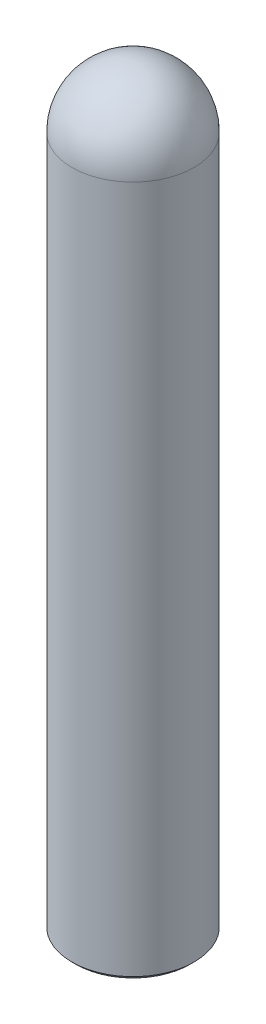
ISO-10303-21;
HEADER;
FILE_DESCRIPTION(('STEP AP214'),'2;1');
FILE_NAME('part.step','',(''),(''),'','','');
FILE_SCHEMA(('AUTOMOTIVE_DESIGN { 1 0 10303 214 1 1 1 1 }'));
ENDSEC;
DATA;
#1=APPLICATION_CONTEXT('core data for automotive mechanical design processes');
#2=APPLICATION_PROTOCOL_DEFINITION('international standard','automotive_design',2000,#1);
#3=PRODUCT_CONTEXT('',#1,'mechanical');
#4=PRODUCT('Part','Part','',(#3));
#5=PRODUCT_RELATED_PRODUCT_CATEGORY('part','',(#4));
#6=PRODUCT_DEFINITION_FORMATION('','',#4);
#7=PRODUCT_DEFINITION_CONTEXT('part definition',#1,'design');
#8=PRODUCT_DEFINITION('design','',#6,#7);
#9=PRODUCT_DEFINITION_SHAPE('','',#8);
#10=(LENGTH_UNIT() NAMED_UNIT(*) SI_UNIT(.MILLI.,.METRE.));
#11=(NAMED_UNIT(*) PLANE_ANGLE_UNIT() SI_UNIT($,.RADIAN.));
#12=(NAMED_UNIT(*) SI_UNIT($,.STERADIAN.) SOLID_ANGLE_UNIT());
#13=UNCERTAINTY_MEASURE_WITH_UNIT(LENGTH_MEASURE(1.E-05),#10,'distance_accuracy_value','');
#14=(GEOMETRIC_REPRESENTATION_CONTEXT(3) GLOBAL_UNCERTAINTY_ASSIGNED_CONTEXT((#13)) GLOBAL_UNIT_ASSIGNED_CONTEXT((#10,
#11,#12)) REPRESENTATION_CONTEXT('',''));
#15=CARTESIAN_POINT('',(0.,0.,0.));
#16=DIRECTION('',(0.,0.,1.));
#17=DIRECTION('',(1.,0.,0.));
#18=AXIS2_PLACEMENT_3D('',#15,#16,#17);
#19=CARTESIAN_POINT('',(0.,185.,0.));
#20=DIRECTION('',(0.,-1.,0.));
#21=DIRECTION('',(0.,0.,-1.));
#22=AXIS2_PLACEMENT_3D('',#19,#20,#21);
#23=CYLINDRICAL_SURFACE('',#22,15.);
#24=CARTESIAN_POINT('',(0.,1.00000000000003,0.));
#25=DIRECTION('',(0.,1.,0.));
#26=DIRECTION('',(0.,0.,1.));
#27=AXIS2_PLACEMENT_3D('',#24,#25,#26);
#28=CIRCLE('',#27,15.);
#29=CARTESIAN_POINT('',(0.,1.00000000000003,15.));
#30=VERTEX_POINT('',#29);
#31=EDGE_CURVE('E41',#30,#30,#28,.T.);
#32=ORIENTED_EDGE('',*,*,#31,.T.);
#33=EDGE_LOOP('',(#32));
#34=FACE_BOUND('',#33,.T.);
#35=CARTESIAN_POINT('',(0.,170.,0.));
#36=DIRECTION('',(0.,-1.,0.));
#37=DIRECTION('',(0.,0.,-1.));
#38=AXIS2_PLACEMENT_3D('',#35,#36,#37);
#39=CIRCLE('',#38,15.);
#40=CARTESIAN_POINT('',(0.,170.,-15.));
#41=VERTEX_POINT('',#40);
#42=EDGE_CURVE('E54',#41,#41,#39,.T.);
#43=ORIENTED_EDGE('',*,*,#42,.T.);
#44=EDGE_LOOP('',(#43));
#45=FACE_BOUND('',#44,.T.);
#46=ADVANCED_FACE('F33',(#34,#45),#23,.T.);
#47=CARTESIAN_POINT('',(0.,0.,0.));
#48=DIRECTION('',(0.,1.,0.));
#49=DIRECTION('',(0.,0.,1.));
#50=AXIS2_PLACEMENT_3D('',#47,#48,#49);
#51=PLANE('',#50);
#52=CARTESIAN_POINT('',(0.,0.,0.));
#53=DIRECTION('',(0.,1.,0.));
#54=DIRECTION('',(0.,0.,1.));
#55=AXIS2_PLACEMENT_3D('',#52,#53,#54);
#56=CIRCLE('',#55,14.);
#57=CARTESIAN_POINT('',(0.,0.,14.));
#58=VERTEX_POINT('',#57);
#59=EDGE_CURVE('E10',#58,#58,#56,.F.);
#60=ORIENTED_EDGE('',*,*,#59,.T.);
#61=EDGE_LOOP('',(#60));
#62=FACE_BOUND('',#61,.T.);
#63=CARTESIAN_POINT('',(0.,0.,0.));
#64=DIRECTION('',(0.,1.,0.));
#65=DIRECTION('',(0.,0.,1.));
#66=AXIS2_PLACEMENT_3D('',#63,#64,#65);
#67=CIRCLE('',#66,3.575);
#68=CARTESIAN_POINT('',(0.,0.,3.575));
#69=VERTEX_POINT('',#68);
#70=EDGE_CURVE('E45',#69,#69,#67,.T.);
#71=ORIENTED_EDGE('',*,*,#70,.T.);
#72=EDGE_LOOP('',(#71));
#73=FACE_BOUND('',#72,.T.);
#74=ADVANCED_FACE('F74',(#62,#73),#51,.F.);
#75=CARTESIAN_POINT('',(0.,170.,0.));
#76=DIRECTION('',(0.,1.,0.));
#77=DIRECTION('',(0.,0.,1.));
#78=AXIS2_PLACEMENT_3D('',#75,#76,#77);
#79=SPHERICAL_SURFACE('',#78,15.);
#80=ORIENTED_EDGE('',*,*,#42,.F.);
#81=EDGE_LOOP('',(#80));
#82=FACE_BOUND('',#81,.T.);
#83=ADVANCED_FACE('F65',(#82),#79,.T.);
#84=CARTESIAN_POINT('',(0.,12.,0.));
#85=DIRECTION('',(0.,-1.,0.));
#86=DIRECTION('',(0.,0.,-1.));
#87=AXIS2_PLACEMENT_3D('',#84,#85,#86);
#88=CYLINDRICAL_SURFACE('',#87,3.175);
#89=CARTESIAN_POINT('',(0.,0.400000000000006,0.));
#90=DIRECTION('',(0.,1.,0.));
#91=DIRECTION('',(0.,0.,1.));
#92=AXIS2_PLACEMENT_3D('',#89,#90,#91);
#93=CIRCLE('',#92,3.175);
#94=CARTESIAN_POINT('',(0.,0.400000000000006,3.175));
#95=VERTEX_POINT('',#94);
#96=EDGE_CURVE('E49',#95,#95,#93,.F.);
#97=ORIENTED_EDGE('',*,*,#96,.T.);
#98=EDGE_LOOP('',(#97));
#99=FACE_BOUND('',#98,.T.);
#100=CARTESIAN_POINT('',(0.,12.,0.));
#101=DIRECTION('',(0.,-1.,0.));
#102=DIRECTION('',(0.,0.,-1.));
#103=AXIS2_PLACEMENT_3D('',#100,#101,#102);
#104=CIRCLE('',#103,3.175);
#105=CARTESIAN_POINT('',(0.,12.,-3.175));
#106=VERTEX_POINT('',#105);
#107=EDGE_CURVE('E57',#106,#106,#104,.T.);
#108=ORIENTED_EDGE('',*,*,#107,.F.);
#109=EDGE_LOOP('',(#108));
#110=FACE_BOUND('',#109,.T.);
#111=ADVANCED_FACE('F63',(#99,#110),#88,.F.);
#112=CARTESIAN_POINT('',(0.,12.,0.));
#113=DIRECTION('',(0.,-1.,0.));
#114=DIRECTION('',(0.,0.,-1.));
#115=AXIS2_PLACEMENT_3D('',#112,#113,#114);
#116=PLANE('',#115);
#117=ORIENTED_EDGE('',*,*,#107,.T.);
#118=EDGE_LOOP('',(#117));
#119=FACE_BOUND('',#118,.T.);
#120=ADVANCED_FACE('F61',(#119),#116,.T.);
#121=CARTESIAN_POINT('',(0.,0.400000000000006,0.));
#122=DIRECTION('',(0.,-1.,0.));
#123=DIRECTION('',(0.,0.,-1.));
#124=AXIS2_PLACEMENT_3D('',#121,#122,#123);
#125=CONICAL_SURFACE('',#124,3.175,0.785398163397435);
#126=ORIENTED_EDGE('',*,*,#70,.F.);
#127=EDGE_LOOP('',(#126));
#128=FACE_BOUND('',#127,.T.);
#129=ORIENTED_EDGE('',*,*,#96,.F.);
#130=EDGE_LOOP('',(#129));
#131=FACE_BOUND('',#130,.T.);
#132=ADVANCED_FACE('F72',(#128,#131),#125,.F.);
#133=CARTESIAN_POINT('',(0.,1.00000000000003,0.));
#134=DIRECTION('',(0.,1.,0.));
#135=DIRECTION('',(0.,0.,1.));
#136=AXIS2_PLACEMENT_3D('',#133,#134,#135);
#137=CONICAL_SURFACE('',#136,15.,0.785398163397447);
#138=ORIENTED_EDGE('',*,*,#59,.F.);
#139=EDGE_LOOP('',(#138));
#140=FACE_BOUND('',#139,.T.);
#141=ORIENTED_EDGE('',*,*,#31,.F.);
#142=EDGE_LOOP('',(#141));
#143=FACE_BOUND('',#142,.T.);
#144=ADVANCED_FACE('F36',(#140,#143),#137,.T.);
#145=CLOSED_SHELL('',(#46,#74,#83,#111,#120,#132,#144));
#146=MANIFOLD_SOLID_BREP('B2',#145);
#147=ADVANCED_BREP_SHAPE_REPRESENTATION('',(#18,#146),#14);
#148=SHAPE_DEFINITION_REPRESENTATION(#9,#147);
ENDSEC;
END-ISO-10303-21;
